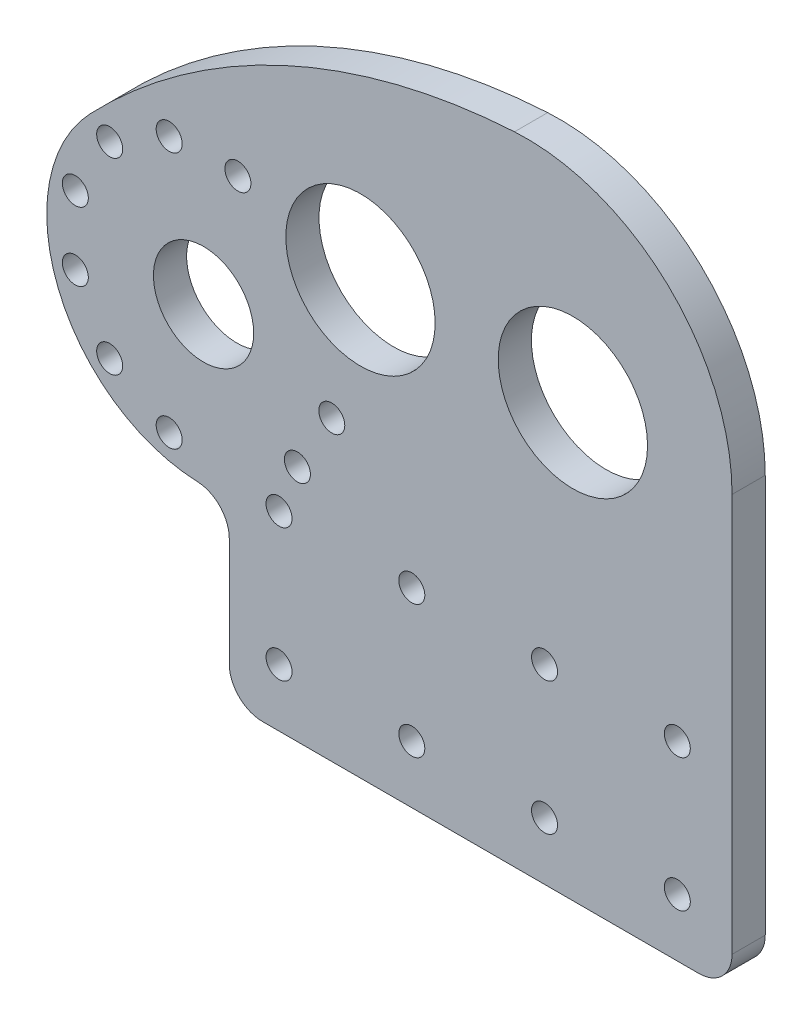
ISO-10303-21;
HEADER;
FILE_DESCRIPTION(('STEP AP214'),'2;1');
FILE_NAME('part.step','',(''),(''),'','','');
FILE_SCHEMA(('AUTOMOTIVE_DESIGN { 1 0 10303 214 1 1 1 1 }'));
ENDSEC;
DATA;
#1=APPLICATION_CONTEXT('core data for automotive mechanical design processes');
#2=APPLICATION_PROTOCOL_DEFINITION('international standard','automotive_design',2000,#1);
#3=PRODUCT_CONTEXT('',#1,'mechanical');
#4=PRODUCT('Part','Part','',(#3));
#5=PRODUCT_RELATED_PRODUCT_CATEGORY('part','',(#4));
#6=PRODUCT_DEFINITION_FORMATION('','',#4);
#7=PRODUCT_DEFINITION_CONTEXT('part definition',#1,'design');
#8=PRODUCT_DEFINITION('design','',#6,#7);
#9=PRODUCT_DEFINITION_SHAPE('','',#8);
#10=(LENGTH_UNIT() NAMED_UNIT(*) SI_UNIT(.MILLI.,.METRE.));
#11=(NAMED_UNIT(*) PLANE_ANGLE_UNIT() SI_UNIT($,.RADIAN.));
#12=(NAMED_UNIT(*) SI_UNIT($,.STERADIAN.) SOLID_ANGLE_UNIT());
#13=UNCERTAINTY_MEASURE_WITH_UNIT(LENGTH_MEASURE(1.E-05),#10,'distance_accuracy_value','');
#14=(GEOMETRIC_REPRESENTATION_CONTEXT(3) GLOBAL_UNCERTAINTY_ASSIGNED_CONTEXT((#13)) GLOBAL_UNIT_ASSIGNED_CONTEXT((#10,
#11,#12)) REPRESENTATION_CONTEXT('',''));
#15=CARTESIAN_POINT('',(0.,0.,0.));
#16=DIRECTION('',(0.,0.,1.));
#17=DIRECTION('',(1.,0.,0.));
#18=AXIS2_PLACEMENT_3D('',#15,#16,#17);
#19=CARTESIAN_POINT('',(533.4,136.8425,3.175));
#20=DIRECTION('',(0.,0.,-1.));
#21=DIRECTION('',(-1.,0.,0.));
#22=AXIS2_PLACEMENT_3D('',#19,#20,#21);
#23=CYLINDRICAL_SURFACE('',#22,2.48919999999989);
#24=CARTESIAN_POINT('',(533.4,136.8425,3.175));
#25=DIRECTION('',(0.,0.,1.));
#26=DIRECTION('',(1.,0.,0.));
#27=AXIS2_PLACEMENT_3D('',#24,#25,#26);
#28=CIRCLE('',#27,2.48919999999989);
#29=CARTESIAN_POINT('',(535.8892,136.8425,3.175));
#30=VERTEX_POINT('',#29);
#31=EDGE_CURVE('E188',#30,#30,#28,.T.);
#32=ORIENTED_EDGE('',*,*,#31,.T.);
#33=EDGE_LOOP('',(#32));
#34=FACE_BOUND('',#33,.T.);
#35=CARTESIAN_POINT('',(533.4,136.8425,-3.175));
#36=DIRECTION('',(0.,0.,1.));
#37=DIRECTION('',(1.,0.,0.));
#38=AXIS2_PLACEMENT_3D('',#35,#36,#37);
#39=CIRCLE('',#38,2.48919999999989);
#40=CARTESIAN_POINT('',(535.8892,136.8425,-3.175));
#41=VERTEX_POINT('',#40);
#42=EDGE_CURVE('E191',#41,#41,#39,.T.);
#43=ORIENTED_EDGE('',*,*,#42,.F.);
#44=EDGE_LOOP('',(#43));
#45=FACE_BOUND('',#44,.T.);
#46=ADVANCED_FACE('F37',(#34,#45),#23,.F.);
#47=CARTESIAN_POINT('',(533.4,111.4425,3.175));
#48=DIRECTION('',(0.,0.,-1.));
#49=DIRECTION('',(-1.,0.,0.));
#50=AXIS2_PLACEMENT_3D('',#47,#48,#49);
#51=CYLINDRICAL_SURFACE('',#50,2.48919999999995);
#52=CARTESIAN_POINT('',(533.4,111.4425,3.175));
#53=DIRECTION('',(0.,0.,1.));
#54=DIRECTION('',(1.,0.,0.));
#55=AXIS2_PLACEMENT_3D('',#52,#53,#54);
#56=CIRCLE('',#55,2.48919999999995);
#57=CARTESIAN_POINT('',(535.8892,111.4425,3.175));
#58=VERTEX_POINT('',#57);
#59=EDGE_CURVE('E182',#58,#58,#56,.T.);
#60=ORIENTED_EDGE('',*,*,#59,.T.);
#61=EDGE_LOOP('',(#60));
#62=FACE_BOUND('',#61,.T.);
#63=CARTESIAN_POINT('',(533.4,111.4425,-3.175));
#64=DIRECTION('',(0.,0.,1.));
#65=DIRECTION('',(1.,0.,0.));
#66=AXIS2_PLACEMENT_3D('',#63,#64,#65);
#67=CIRCLE('',#66,2.48919999999995);
#68=CARTESIAN_POINT('',(535.8892,111.4425,-3.175));
#69=VERTEX_POINT('',#68);
#70=EDGE_CURVE('E185',#69,#69,#67,.T.);
#71=ORIENTED_EDGE('',*,*,#70,.F.);
#72=EDGE_LOOP('',(#71));
#73=FACE_BOUND('',#72,.T.);
#74=ADVANCED_FACE('F345',(#62,#73),#51,.F.);
#75=CARTESIAN_POINT('',(508.,136.8425,3.175));
#76=DIRECTION('',(0.,0.,-1.));
#77=DIRECTION('',(-1.,0.,0.));
#78=AXIS2_PLACEMENT_3D('',#75,#76,#77);
#79=CYLINDRICAL_SURFACE('',#78,2.48919999999989);
#80=CARTESIAN_POINT('',(508.,136.8425,3.175));
#81=DIRECTION('',(0.,0.,1.));
#82=DIRECTION('',(1.,0.,0.));
#83=AXIS2_PLACEMENT_3D('',#80,#81,#82);
#84=CIRCLE('',#83,2.48919999999989);
#85=CARTESIAN_POINT('',(510.4892,136.8425,3.175));
#86=VERTEX_POINT('',#85);
#87=EDGE_CURVE('E176',#86,#86,#84,.T.);
#88=ORIENTED_EDGE('',*,*,#87,.T.);
#89=EDGE_LOOP('',(#88));
#90=FACE_BOUND('',#89,.T.);
#91=CARTESIAN_POINT('',(508.,136.8425,-3.175));
#92=DIRECTION('',(0.,0.,1.));
#93=DIRECTION('',(1.,0.,0.));
#94=AXIS2_PLACEMENT_3D('',#91,#92,#93);
#95=CIRCLE('',#94,2.48919999999989);
#96=CARTESIAN_POINT('',(510.4892,136.8425,-3.175));
#97=VERTEX_POINT('',#96);
#98=EDGE_CURVE('E179',#97,#97,#95,.T.);
#99=ORIENTED_EDGE('',*,*,#98,.F.);
#100=EDGE_LOOP('',(#99));
#101=FACE_BOUND('',#100,.T.);
#102=ADVANCED_FACE('F351',(#90,#101),#79,.F.);
#103=CARTESIAN_POINT('',(508.,111.4425,3.175));
#104=DIRECTION('',(0.,0.,-1.));
#105=DIRECTION('',(-1.,0.,0.));
#106=AXIS2_PLACEMENT_3D('',#103,#104,#105);
#107=CYLINDRICAL_SURFACE('',#106,2.48919999999995);
#108=CARTESIAN_POINT('',(508.,111.4425,3.175));
#109=DIRECTION('',(0.,0.,1.));
#110=DIRECTION('',(1.,0.,0.));
#111=AXIS2_PLACEMENT_3D('',#108,#109,#110);
#112=CIRCLE('',#111,2.48919999999995);
#113=CARTESIAN_POINT('',(510.4892,111.4425,3.175));
#114=VERTEX_POINT('',#113);
#115=EDGE_CURVE('E170',#114,#114,#112,.T.);
#116=ORIENTED_EDGE('',*,*,#115,.T.);
#117=EDGE_LOOP('',(#116));
#118=FACE_BOUND('',#117,.T.);
#119=CARTESIAN_POINT('',(508.,111.4425,-3.175));
#120=DIRECTION('',(0.,0.,1.));
#121=DIRECTION('',(1.,0.,0.));
#122=AXIS2_PLACEMENT_3D('',#119,#120,#121);
#123=CIRCLE('',#122,2.48919999999995);
#124=CARTESIAN_POINT('',(510.4892,111.4425,-3.175));
#125=VERTEX_POINT('',#124);
#126=EDGE_CURVE('E173',#125,#125,#123,.T.);
#127=ORIENTED_EDGE('',*,*,#126,.F.);
#128=EDGE_LOOP('',(#127));
#129=FACE_BOUND('',#128,.T.);
#130=ADVANCED_FACE('F382',(#118,#129),#107,.F.);
#131=CARTESIAN_POINT('',(482.6,136.8425,3.175));
#132=DIRECTION('',(0.,0.,-1.));
#133=DIRECTION('',(-1.,0.,0.));
#134=AXIS2_PLACEMENT_3D('',#131,#132,#133);
#135=CYLINDRICAL_SURFACE('',#134,2.48919999999989);
#136=CARTESIAN_POINT('',(482.6,136.8425,3.175));
#137=DIRECTION('',(0.,0.,1.));
#138=DIRECTION('',(1.,0.,0.));
#139=AXIS2_PLACEMENT_3D('',#136,#137,#138);
#140=CIRCLE('',#139,2.48919999999989);
#141=CARTESIAN_POINT('',(485.0892,136.8425,3.175));
#142=VERTEX_POINT('',#141);
#143=EDGE_CURVE('E164',#142,#142,#140,.T.);
#144=ORIENTED_EDGE('',*,*,#143,.T.);
#145=EDGE_LOOP('',(#144));
#146=FACE_BOUND('',#145,.T.);
#147=CARTESIAN_POINT('',(482.6,136.8425,-3.175));
#148=DIRECTION('',(0.,0.,1.));
#149=DIRECTION('',(1.,0.,0.));
#150=AXIS2_PLACEMENT_3D('',#147,#148,#149);
#151=CIRCLE('',#150,2.48919999999989);
#152=CARTESIAN_POINT('',(485.0892,136.8425,-3.175));
#153=VERTEX_POINT('',#152);
#154=EDGE_CURVE('E167',#153,#153,#151,.T.);
#155=ORIENTED_EDGE('',*,*,#154,.F.);
#156=EDGE_LOOP('',(#155));
#157=FACE_BOUND('',#156,.T.);
#158=ADVANCED_FACE('F338',(#146,#157),#135,.F.);
#159=CARTESIAN_POINT('',(482.6,111.4425,3.175));
#160=DIRECTION('',(0.,0.,-1.));
#161=DIRECTION('',(-1.,0.,0.));
#162=AXIS2_PLACEMENT_3D('',#159,#160,#161);
#163=CYLINDRICAL_SURFACE('',#162,2.48919999999995);
#164=CARTESIAN_POINT('',(482.6,111.4425,3.175));
#165=DIRECTION('',(0.,0.,1.));
#166=DIRECTION('',(1.,0.,0.));
#167=AXIS2_PLACEMENT_3D('',#164,#165,#166);
#168=CIRCLE('',#167,2.48919999999995);
#169=CARTESIAN_POINT('',(485.0892,111.4425,3.175));
#170=VERTEX_POINT('',#169);
#171=EDGE_CURVE('E124',#170,#170,#168,.T.);
#172=ORIENTED_EDGE('',*,*,#171,.T.);
#173=EDGE_LOOP('',(#172));
#174=FACE_BOUND('',#173,.T.);
#175=CARTESIAN_POINT('',(482.6,111.4425,-3.175));
#176=DIRECTION('',(0.,0.,1.));
#177=DIRECTION('',(1.,0.,0.));
#178=AXIS2_PLACEMENT_3D('',#175,#176,#177);
#179=CIRCLE('',#178,2.48919999999995);
#180=CARTESIAN_POINT('',(485.0892,111.4425,-3.175));
#181=VERTEX_POINT('',#180);
#182=EDGE_CURVE('E161',#181,#181,#179,.T.);
#183=ORIENTED_EDGE('',*,*,#182,.F.);
#184=EDGE_LOOP('',(#183));
#185=FACE_BOUND('',#184,.T.);
#186=ADVANCED_FACE('F329',(#174,#185),#163,.F.);
#187=CARTESIAN_POINT('',(504.531091269929,182.9435,3.175));
#188=DIRECTION('',(0.,0.,-1.));
#189=DIRECTION('',(-1.,0.,0.));
#190=AXIS2_PLACEMENT_3D('',#187,#188,#189);
#191=PLANE('',#190);
#192=ORIENTED_EDGE('',*,*,#31,.F.);
#193=EDGE_LOOP('',(#192));
#194=FACE_BOUND('',#193,.T.);
#195=ORIENTED_EDGE('',*,*,#59,.F.);
#196=EDGE_LOOP('',(#195));
#197=FACE_BOUND('',#196,.T.);
#198=ORIENTED_EDGE('',*,*,#87,.F.);
#199=EDGE_LOOP('',(#198));
#200=FACE_BOUND('',#199,.T.);
#201=ORIENTED_EDGE('',*,*,#115,.F.);
#202=EDGE_LOOP('',(#201));
#203=FACE_BOUND('',#202,.T.);
#204=ORIENTED_EDGE('',*,*,#143,.F.);
#205=EDGE_LOOP('',(#204));
#206=FACE_BOUND('',#205,.T.);
#207=ORIENTED_EDGE('',*,*,#171,.F.);
#208=EDGE_LOOP('',(#207));
#209=FACE_BOUND('',#208,.T.);
#210=DIRECTION('',(0.,-1.,0.));
#211=VECTOR('',#210,1.);
#212=CARTESIAN_POINT('',(447.675,100.3935,3.175));
#213=LINE('',#212,#211);
#214=CARTESIAN_POINT('',(447.675,127.571609413663,3.175));
#215=VERTEX_POINT('',#214);
#216=CARTESIAN_POINT('',(447.675,106.7435,3.175));
#217=VERTEX_POINT('',#216);
#218=EDGE_CURVE('E138',#215,#217,#213,.T.);
#219=ORIENTED_EDGE('',*,*,#218,.T.);
#220=CARTESIAN_POINT('',(454.025,106.7435,3.175));
#221=DIRECTION('',(0.,0.,-1.));
#222=DIRECTION('',(-1.,0.,0.));
#223=AXIS2_PLACEMENT_3D('',#220,#221,#222);
#224=CIRCLE('',#223,6.35);
#225=CARTESIAN_POINT('',(454.025,100.3935,3.175));
#226=VERTEX_POINT('',#225);
#227=EDGE_CURVE('E210',#217,#226,#224,.F.);
#228=ORIENTED_EDGE('',*,*,#227,.T.);
#229=DIRECTION('',(1.,0.,0.));
#230=VECTOR('',#229,1.);
#231=CARTESIAN_POINT('',(447.675,100.3935,3.175));
#232=LINE('',#231,#230);
#233=CARTESIAN_POINT('',(537.5275,100.3935,3.175));
#234=VERTEX_POINT('',#233);
#235=EDGE_CURVE('E115',#226,#234,#232,.T.);
#236=ORIENTED_EDGE('',*,*,#235,.T.);
#237=CARTESIAN_POINT('',(537.5275,106.7435,3.175));
#238=DIRECTION('',(0.,0.,-1.));
#239=DIRECTION('',(-1.,0.,0.));
#240=AXIS2_PLACEMENT_3D('',#237,#238,#239);
#241=CIRCLE('',#240,6.35);
#242=CARTESIAN_POINT('',(543.8775,106.7435,3.175));
#243=VERTEX_POINT('',#242);
#244=EDGE_CURVE('E52',#234,#243,#241,.F.);
#245=ORIENTED_EDGE('',*,*,#244,.T.);
#246=DIRECTION('',(0.,1.,0.));
#247=VECTOR('',#246,1.);
#248=CARTESIAN_POINT('',(543.8775,100.3935,3.175));
#249=LINE('',#248,#247);
#250=CARTESIAN_POINT('',(543.8775,182.9435,3.175));
#251=VERTEX_POINT('',#250);
#252=EDGE_CURVE('E106',#243,#251,#249,.T.);
#253=ORIENTED_EDGE('',*,*,#252,.T.);
#254=CARTESIAN_POINT('',(504.531091269929,182.9435,3.175));
#255=DIRECTION('',(0.,0.,1.));
#256=DIRECTION('',(-1.,0.,0.));
#257=AXIS2_PLACEMENT_3D('',#254,#255,#256);
#258=CIRCLE('',#257,39.3464087300712);
#259=CARTESIAN_POINT('',(502.250352488172,222.223750897407,3.175));
#260=VERTEX_POINT('',#259);
#261=EDGE_CURVE('E112',#251,#260,#258,.T.);
#262=ORIENTED_EDGE('',*,*,#261,.T.);
#263=CARTESIAN_POINT('',(509.316361248878,100.528711034053,3.175));
#264=DIRECTION('',(0.,0.,1.));
#265=DIRECTION('',(-1.,0.,0.));
#266=AXIS2_PLACEMENT_3D('',#263,#264,#265);
#267=CIRCLE('',#266,121.900004951393);
#268=CARTESIAN_POINT('',(421.02559897986,184.578413621899,3.175));
#269=VERTEX_POINT('',#268);
#270=EDGE_CURVE('E130',#260,#269,#267,.T.);
#271=ORIENTED_EDGE('',*,*,#270,.T.);
#272=CARTESIAN_POINT('',(442.754251609386,163.8935,3.175));
#273=DIRECTION('',(0.,0.,1.));
#274=DIRECTION('',(-1.,0.,0.));
#275=AXIS2_PLACEMENT_3D('',#272,#273,#274);
#276=CIRCLE('',#275,29.999999944);
#277=CARTESIAN_POINT('',(441.574676691433,133.916698975659,3.175));
#278=VERTEX_POINT('',#277);
#279=EDGE_CURVE('E132',#269,#278,#276,.T.);
#280=ORIENTED_EDGE('',*,*,#279,.T.);
#281=CARTESIAN_POINT('',(441.325,127.571609413663,3.175));
#282=DIRECTION('',(0.,0.,-1.));
#283=DIRECTION('',(-1.,0.,0.));
#284=AXIS2_PLACEMENT_3D('',#281,#282,#283);
#285=CIRCLE('',#284,6.35);
#286=EDGE_CURVE('E11',#278,#215,#285,.T.);
#287=ORIENTED_EDGE('',*,*,#286,.T.);
#288=EDGE_LOOP('',(#219,#228,#236,#245,#253,#262,#271,#280,#287));
#289=FACE_BOUND('',#288,.T.);
#290=CARTESIAN_POINT('',(513.421091269929,182.9435,3.175));
#291=DIRECTION('',(0.,0.,1.));
#292=DIRECTION('',(1.,0.,0.));
#293=AXIS2_PLACEMENT_3D('',#290,#291,#292);
#294=CIRCLE('',#293,14.2875);
#295=CARTESIAN_POINT('',(527.708591269929,182.9435,3.175));
#296=VERTEX_POINT('',#295);
#297=EDGE_CURVE('E144',#296,#296,#294,.T.);
#298=ORIENTED_EDGE('',*,*,#297,.F.);
#299=EDGE_LOOP('',(#298));
#300=FACE_BOUND('',#299,.T.);
#301=CARTESIAN_POINT('',(449.32825535499,188.428015987742,3.175));
#302=DIRECTION('',(0.,0.,1.));
#303=DIRECTION('',(1.,0.,0.));
#304=AXIS2_PLACEMENT_3D('',#301,#302,#303);
#305=CIRCLE('',#304,2.48920000000001);
#306=CARTESIAN_POINT('',(451.81745535499,188.428015987742,3.175));
#307=VERTEX_POINT('',#306);
#308=EDGE_CURVE('E244',#307,#307,#305,.T.);
#309=ORIENTED_EDGE('',*,*,#308,.F.);
#310=EDGE_LOOP('',(#309));
#311=FACE_BOUND('',#310,.T.);
#312=CARTESIAN_POINT('',(467.288767597128,157.319496254396,3.175));
#313=DIRECTION('',(0.,0.,1.));
#314=DIRECTION('',(1.,0.,0.));
#315=AXIS2_PLACEMENT_3D('',#312,#313,#314);
#316=CIRCLE('',#315,2.48920000000001);
#317=CARTESIAN_POINT('',(469.777967597128,157.319496254396,3.175));
#318=VERTEX_POINT('',#317);
#319=EDGE_CURVE('E250',#318,#318,#316,.T.);
#320=ORIENTED_EDGE('',*,*,#319,.F.);
#321=EDGE_LOOP('',(#320));
#322=FACE_BOUND('',#321,.T.);
#323=CARTESIAN_POINT('',(460.714763851524,145.932987757862,3.175));
#324=DIRECTION('',(0.,0.,1.));
#325=DIRECTION('',(1.,0.,0.));
#326=AXIS2_PLACEMENT_3D('',#323,#324,#325);
#327=CIRCLE('',#326,2.48919999999995);
#328=CARTESIAN_POINT('',(463.203963851524,145.932987757862,3.175));
#329=VERTEX_POINT('',#328);
#330=EDGE_CURVE('E256',#329,#329,#327,.T.);
#331=ORIENTED_EDGE('',*,*,#330,.F.);
#332=EDGE_LOOP('',(#331));
#333=FACE_BOUND('',#332,.T.);
#334=CARTESIAN_POINT('',(436.180247863782,139.358984012258,3.175));
#335=DIRECTION('',(0.,0.,1.));
#336=DIRECTION('',(1.,0.,0.));
#337=AXIS2_PLACEMENT_3D('',#334,#335,#336);
#338=CIRCLE('',#337,2.48920000000001);
#339=CARTESIAN_POINT('',(438.669447863782,139.358984012258,3.175));
#340=VERTEX_POINT('',#339);
#341=EDGE_CURVE('E262',#340,#340,#338,.T.);
#342=ORIENTED_EDGE('',*,*,#341,.F.);
#343=EDGE_LOOP('',(#342));
#344=FACE_BOUND('',#343,.T.);
#345=CARTESIAN_POINT('',(424.793739367247,145.932987757862,3.175));
#346=DIRECTION('',(0.,0.,1.));
#347=DIRECTION('',(1.,0.,0.));
#348=AXIS2_PLACEMENT_3D('',#345,#346,#347);
#349=CIRCLE('',#348,2.48919999999995);
#350=CARTESIAN_POINT('',(427.282939367247,145.932987757862,3.175));
#351=VERTEX_POINT('',#350);
#352=EDGE_CURVE('E268',#351,#351,#349,.T.);
#353=ORIENTED_EDGE('',*,*,#352,.F.);
#354=EDGE_LOOP('',(#353));
#355=FACE_BOUND('',#354,.T.);
#356=CARTESIAN_POINT('',(472.781091269929,182.9435,3.175));
#357=DIRECTION('',(0.,0.,1.));
#358=DIRECTION('',(1.,0.,0.));
#359=AXIS2_PLACEMENT_3D('',#356,#357,#358);
#360=CIRCLE('',#359,14.2875);
#361=CARTESIAN_POINT('',(487.068591269929,182.9435,3.175));
#362=VERTEX_POINT('',#361);
#363=EDGE_CURVE('E274',#362,#362,#360,.T.);
#364=ORIENTED_EDGE('',*,*,#363,.F.);
#365=EDGE_LOOP('',(#364));
#366=FACE_BOUND('',#365,.T.);
#367=CARTESIAN_POINT('',(418.219735621643,157.319496254396,3.175));
#368=DIRECTION('',(0.,0.,1.));
#369=DIRECTION('',(1.,0.,0.));
#370=AXIS2_PLACEMENT_3D('',#367,#368,#369);
#371=CIRCLE('',#370,2.48920000000001);
#372=CARTESIAN_POINT('',(420.708935621643,157.319496254396,3.175));
#373=VERTEX_POINT('',#372);
#374=EDGE_CURVE('E280',#373,#373,#371,.T.);
#375=ORIENTED_EDGE('',*,*,#374,.F.);
#376=EDGE_LOOP('',(#375));
#377=FACE_BOUND('',#376,.T.);
#378=CARTESIAN_POINT('',(418.219735621643,170.467503745604,3.175));
#379=DIRECTION('',(0.,0.,1.));
#380=DIRECTION('',(1.,0.,0.));
#381=AXIS2_PLACEMENT_3D('',#378,#379,#380);
#382=CIRCLE('',#381,2.48920000000001);
#383=CARTESIAN_POINT('',(420.708935621643,170.467503745604,3.175));
#384=VERTEX_POINT('',#383);
#385=EDGE_CURVE('E286',#384,#384,#382,.T.);
#386=ORIENTED_EDGE('',*,*,#385,.F.);
#387=EDGE_LOOP('',(#386));
#388=FACE_BOUND('',#387,.T.);
#389=CARTESIAN_POINT('',(424.793739367247,181.854012242138,3.175));
#390=DIRECTION('',(0.,0.,1.));
#391=DIRECTION('',(1.,0.,0.));
#392=AXIS2_PLACEMENT_3D('',#389,#390,#391);
#393=CIRCLE('',#392,2.48919999999995);
#394=CARTESIAN_POINT('',(427.282939367247,181.854012242138,3.175));
#395=VERTEX_POINT('',#394);
#396=EDGE_CURVE('E292',#395,#395,#393,.T.);
#397=ORIENTED_EDGE('',*,*,#396,.F.);
#398=EDGE_LOOP('',(#397));
#399=FACE_BOUND('',#398,.T.);
#400=CARTESIAN_POINT('',(436.180247863782,188.428015987742,3.175));
#401=DIRECTION('',(0.,0.,1.));
#402=DIRECTION('',(1.,0.,0.));
#403=AXIS2_PLACEMENT_3D('',#400,#401,#402);
#404=CIRCLE('',#403,2.48920000000001);
#405=CARTESIAN_POINT('',(438.669447863782,188.428015987742,3.175));
#406=VERTEX_POINT('',#405);
#407=EDGE_CURVE('E298',#406,#406,#404,.T.);
#408=ORIENTED_EDGE('',*,*,#407,.F.);
#409=EDGE_LOOP('',(#408));
#410=FACE_BOUND('',#409,.T.);
#411=CARTESIAN_POINT('',(457.2,111.4425,3.175));
#412=DIRECTION('',(0.,0.,1.));
#413=DIRECTION('',(1.,0.,0.));
#414=AXIS2_PLACEMENT_3D('',#411,#412,#413);
#415=CIRCLE('',#414,2.48919999999995);
#416=CARTESIAN_POINT('',(459.6892,111.4425,3.175));
#417=VERTEX_POINT('',#416);
#418=EDGE_CURVE('E304',#417,#417,#415,.T.);
#419=ORIENTED_EDGE('',*,*,#418,.F.);
#420=EDGE_LOOP('',(#419));
#421=FACE_BOUND('',#420,.T.);
#422=CARTESIAN_POINT('',(457.2,136.8425,3.175));
#423=DIRECTION('',(0.,0.,1.));
#424=DIRECTION('',(1.,0.,0.));
#425=AXIS2_PLACEMENT_3D('',#422,#423,#424);
#426=CIRCLE('',#425,2.48919999999989);
#427=CARTESIAN_POINT('',(459.6892,136.8425,3.175));
#428=VERTEX_POINT('',#427);
#429=EDGE_CURVE('E310',#428,#428,#426,.T.);
#430=ORIENTED_EDGE('',*,*,#429,.F.);
#431=EDGE_LOOP('',(#430));
#432=FACE_BOUND('',#431,.T.);
#433=CARTESIAN_POINT('',(442.754251609386,163.8935,3.175));
#434=DIRECTION('',(0.,0.,1.));
#435=DIRECTION('',(1.,0.,0.));
#436=AXIS2_PLACEMENT_3D('',#433,#434,#435);
#437=CIRCLE('',#436,9.5885);
#438=CARTESIAN_POINT('',(452.342751609386,163.8935,3.175));
#439=VERTEX_POINT('',#438);
#440=EDGE_CURVE('E316',#439,#439,#437,.T.);
#441=ORIENTED_EDGE('',*,*,#440,.F.);
#442=EDGE_LOOP('',(#441));
#443=FACE_BOUND('',#442,.T.);
#444=ADVANCED_FACE('F109',(#194,#197,#200,#203,#206,#209,#289,#300,#311,#322,#333,#344,#355,
#366,#377,#388,#399,#410,#421,#432,#443),#191,.F.);
#445=CARTESIAN_POINT('',(504.531091269929,182.9435,-3.175));
#446=DIRECTION('',(0.,0.,-1.));
#447=DIRECTION('',(-1.,0.,0.));
#448=AXIS2_PLACEMENT_3D('',#445,#446,#447);
#449=PLANE('',#448);
#450=ORIENTED_EDGE('',*,*,#70,.T.);
#451=EDGE_LOOP('',(#450));
#452=FACE_BOUND('',#451,.T.);
#453=ORIENTED_EDGE('',*,*,#42,.T.);
#454=EDGE_LOOP('',(#453));
#455=FACE_BOUND('',#454,.T.);
#456=ORIENTED_EDGE('',*,*,#126,.T.);
#457=EDGE_LOOP('',(#456));
#458=FACE_BOUND('',#457,.T.);
#459=ORIENTED_EDGE('',*,*,#98,.T.);
#460=EDGE_LOOP('',(#459));
#461=FACE_BOUND('',#460,.T.);
#462=ORIENTED_EDGE('',*,*,#182,.T.);
#463=EDGE_LOOP('',(#462));
#464=FACE_BOUND('',#463,.T.);
#465=ORIENTED_EDGE('',*,*,#154,.T.);
#466=EDGE_LOOP('',(#465));
#467=FACE_BOUND('',#466,.T.);
#468=CARTESIAN_POINT('',(457.2,136.8425,-3.175));
#469=DIRECTION('',(0.,0.,1.));
#470=DIRECTION('',(1.,0.,0.));
#471=AXIS2_PLACEMENT_3D('',#468,#469,#470);
#472=CIRCLE('',#471,2.48919999999989);
#473=CARTESIAN_POINT('',(459.6892,136.8425,-3.175));
#474=VERTEX_POINT('',#473);
#475=EDGE_CURVE('E313',#474,#474,#472,.T.);
#476=ORIENTED_EDGE('',*,*,#475,.T.);
#477=EDGE_LOOP('',(#476));
#478=FACE_BOUND('',#477,.T.);
#479=CARTESIAN_POINT('',(436.180247863782,188.428015987742,-3.175));
#480=DIRECTION('',(0.,0.,1.));
#481=DIRECTION('',(1.,0.,0.));
#482=AXIS2_PLACEMENT_3D('',#479,#480,#481);
#483=CIRCLE('',#482,2.48920000000001);
#484=CARTESIAN_POINT('',(438.669447863782,188.428015987742,-3.175));
#485=VERTEX_POINT('',#484);
#486=EDGE_CURVE('E301',#485,#485,#483,.T.);
#487=ORIENTED_EDGE('',*,*,#486,.T.);
#488=EDGE_LOOP('',(#487));
#489=FACE_BOUND('',#488,.T.);
#490=CARTESIAN_POINT('',(418.219735621643,170.467503745604,-3.175));
#491=DIRECTION('',(0.,0.,1.));
#492=DIRECTION('',(1.,0.,0.));
#493=AXIS2_PLACEMENT_3D('',#490,#491,#492);
#494=CIRCLE('',#493,2.48920000000001);
#495=CARTESIAN_POINT('',(420.708935621643,170.467503745604,-3.175));
#496=VERTEX_POINT('',#495);
#497=EDGE_CURVE('E289',#496,#496,#494,.T.);
#498=ORIENTED_EDGE('',*,*,#497,.T.);
#499=EDGE_LOOP('',(#498));
#500=FACE_BOUND('',#499,.T.);
#501=CARTESIAN_POINT('',(472.781091269929,182.9435,-3.175));
#502=DIRECTION('',(0.,0.,1.));
#503=DIRECTION('',(1.,0.,0.));
#504=AXIS2_PLACEMENT_3D('',#501,#502,#503);
#505=CIRCLE('',#504,14.2875);
#506=CARTESIAN_POINT('',(487.068591269929,182.9435,-3.175));
#507=VERTEX_POINT('',#506);
#508=EDGE_CURVE('E277',#507,#507,#505,.T.);
#509=ORIENTED_EDGE('',*,*,#508,.T.);
#510=EDGE_LOOP('',(#509));
#511=FACE_BOUND('',#510,.T.);
#512=CARTESIAN_POINT('',(436.180247863782,139.358984012258,-3.175));
#513=DIRECTION('',(0.,0.,1.));
#514=DIRECTION('',(1.,0.,0.));
#515=AXIS2_PLACEMENT_3D('',#512,#513,#514);
#516=CIRCLE('',#515,2.48920000000001);
#517=CARTESIAN_POINT('',(438.669447863782,139.358984012258,-3.175));
#518=VERTEX_POINT('',#517);
#519=EDGE_CURVE('E265',#518,#518,#516,.T.);
#520=ORIENTED_EDGE('',*,*,#519,.T.);
#521=EDGE_LOOP('',(#520));
#522=FACE_BOUND('',#521,.T.);
#523=CARTESIAN_POINT('',(467.288767597128,157.319496254396,-3.175));
#524=DIRECTION('',(0.,0.,1.));
#525=DIRECTION('',(1.,0.,0.));
#526=AXIS2_PLACEMENT_3D('',#523,#524,#525);
#527=CIRCLE('',#526,2.48920000000001);
#528=CARTESIAN_POINT('',(469.777967597128,157.319496254396,-3.175));
#529=VERTEX_POINT('',#528);
#530=EDGE_CURVE('E253',#529,#529,#527,.T.);
#531=ORIENTED_EDGE('',*,*,#530,.T.);
#532=EDGE_LOOP('',(#531));
#533=FACE_BOUND('',#532,.T.);
#534=CARTESIAN_POINT('',(513.421091269929,182.9435,-3.175));
#535=DIRECTION('',(0.,0.,1.));
#536=DIRECTION('',(1.,0.,0.));
#537=AXIS2_PLACEMENT_3D('',#534,#535,#536);
#538=CIRCLE('',#537,14.2875);
#539=CARTESIAN_POINT('',(527.708591269929,182.9435,-3.175));
#540=VERTEX_POINT('',#539);
#541=EDGE_CURVE('E241',#540,#540,#538,.T.);
#542=ORIENTED_EDGE('',*,*,#541,.T.);
#543=EDGE_LOOP('',(#542));
#544=FACE_BOUND('',#543,.T.);
#545=DIRECTION('',(1.,0.,0.));
#546=VECTOR('',#545,1.);
#547=CARTESIAN_POINT('',(447.675,100.3935,-3.175));
#548=LINE('',#547,#546);
#549=CARTESIAN_POINT('',(454.025,100.3935,-3.175));
#550=VERTEX_POINT('',#549);
#551=CARTESIAN_POINT('',(537.5275,100.3935,-3.175));
#552=VERTEX_POINT('',#551);
#553=EDGE_CURVE('E141',#550,#552,#548,.T.);
#554=ORIENTED_EDGE('',*,*,#553,.F.);
#555=CARTESIAN_POINT('',(454.025,106.7435,-3.175));
#556=DIRECTION('',(0.,0.,-1.));
#557=DIRECTION('',(-1.,0.,0.));
#558=AXIS2_PLACEMENT_3D('',#555,#556,#557);
#559=CIRCLE('',#558,6.35);
#560=CARTESIAN_POINT('',(447.675,106.7435,-3.175));
#561=VERTEX_POINT('',#560);
#562=EDGE_CURVE('E207',#550,#561,#559,.T.);
#563=ORIENTED_EDGE('',*,*,#562,.T.);
#564=DIRECTION('',(0.,-1.,0.));
#565=VECTOR('',#564,1.);
#566=CARTESIAN_POINT('',(447.675,100.3935,-3.175));
#567=LINE('',#566,#565);
#568=CARTESIAN_POINT('',(447.675,127.571609413663,-3.175));
#569=VERTEX_POINT('',#568);
#570=EDGE_CURVE('E153',#569,#561,#567,.T.);
#571=ORIENTED_EDGE('',*,*,#570,.F.);
#572=CARTESIAN_POINT('',(441.325,127.571609413663,-3.175));
#573=DIRECTION('',(0.,0.,-1.));
#574=DIRECTION('',(-1.,0.,0.));
#575=AXIS2_PLACEMENT_3D('',#572,#573,#574);
#576=CIRCLE('',#575,6.35);
#577=CARTESIAN_POINT('',(441.574676691433,133.916698975659,-3.175));
#578=VERTEX_POINT('',#577);
#579=EDGE_CURVE('E45',#569,#578,#576,.F.);
#580=ORIENTED_EDGE('',*,*,#579,.T.);
#581=CARTESIAN_POINT('',(442.754251609386,163.8935,-3.175));
#582=DIRECTION('',(0.,0.,1.));
#583=DIRECTION('',(-1.,0.,0.));
#584=AXIS2_PLACEMENT_3D('',#581,#582,#583);
#585=CIRCLE('',#584,29.999999944);
#586=CARTESIAN_POINT('',(421.02559897986,184.578413621899,-3.175));
#587=VERTEX_POINT('',#586);
#588=EDGE_CURVE('E150',#587,#578,#585,.T.);
#589=ORIENTED_EDGE('',*,*,#588,.F.);
#590=CARTESIAN_POINT('',(509.316361248878,100.528711034053,-3.175));
#591=DIRECTION('',(0.,0.,1.));
#592=DIRECTION('',(-1.,0.,0.));
#593=AXIS2_PLACEMENT_3D('',#590,#591,#592);
#594=CIRCLE('',#593,121.900004951393);
#595=CARTESIAN_POINT('',(502.250352488172,222.223750897407,-3.175));
#596=VERTEX_POINT('',#595);
#597=EDGE_CURVE('E148',#596,#587,#594,.T.);
#598=ORIENTED_EDGE('',*,*,#597,.F.);
#599=CARTESIAN_POINT('',(504.531091269929,182.9435,-3.175));
#600=DIRECTION('',(0.,0.,1.));
#601=DIRECTION('',(-1.,0.,0.));
#602=AXIS2_PLACEMENT_3D('',#599,#600,#601);
#603=CIRCLE('',#602,39.3464087300712);
#604=CARTESIAN_POINT('',(543.8775,182.9435,-3.175));
#605=VERTEX_POINT('',#604);
#606=EDGE_CURVE('E146',#605,#596,#603,.T.);
#607=ORIENTED_EDGE('',*,*,#606,.F.);
#608=DIRECTION('',(0.,1.,0.));
#609=VECTOR('',#608,1.);
#610=CARTESIAN_POINT('',(543.8775,100.3935,-3.175));
#611=LINE('',#610,#609);
#612=CARTESIAN_POINT('',(543.8775,106.7435,-3.175));
#613=VERTEX_POINT('',#612);
#614=EDGE_CURVE('E121',#613,#605,#611,.T.);
#615=ORIENTED_EDGE('',*,*,#614,.F.);
#616=CARTESIAN_POINT('',(537.5275,106.7435,-3.175));
#617=DIRECTION('',(0.,0.,-1.));
#618=DIRECTION('',(-1.,0.,0.));
#619=AXIS2_PLACEMENT_3D('',#616,#617,#618);
#620=CIRCLE('',#619,6.35);
#621=EDGE_CURVE('E60',#613,#552,#620,.T.);
#622=ORIENTED_EDGE('',*,*,#621,.T.);
#623=EDGE_LOOP('',(#554,#563,#571,#580,#589,#598,#607,#615,#622));
#624=FACE_BOUND('',#623,.T.);
#625=CARTESIAN_POINT('',(449.32825535499,188.428015987742,-3.175));
#626=DIRECTION('',(0.,0.,1.));
#627=DIRECTION('',(1.,0.,0.));
#628=AXIS2_PLACEMENT_3D('',#625,#626,#627);
#629=CIRCLE('',#628,2.48920000000001);
#630=CARTESIAN_POINT('',(451.81745535499,188.428015987742,-3.175));
#631=VERTEX_POINT('',#630);
#632=EDGE_CURVE('E247',#631,#631,#629,.T.);
#633=ORIENTED_EDGE('',*,*,#632,.T.);
#634=EDGE_LOOP('',(#633));
#635=FACE_BOUND('',#634,.T.);
#636=CARTESIAN_POINT('',(460.714763851524,145.932987757862,-3.175));
#637=DIRECTION('',(0.,0.,1.));
#638=DIRECTION('',(1.,0.,0.));
#639=AXIS2_PLACEMENT_3D('',#636,#637,#638);
#640=CIRCLE('',#639,2.48919999999995);
#641=CARTESIAN_POINT('',(463.203963851524,145.932987757862,-3.175));
#642=VERTEX_POINT('',#641);
#643=EDGE_CURVE('E259',#642,#642,#640,.T.);
#644=ORIENTED_EDGE('',*,*,#643,.T.);
#645=EDGE_LOOP('',(#644));
#646=FACE_BOUND('',#645,.T.);
#647=CARTESIAN_POINT('',(424.793739367247,145.932987757862,-3.175));
#648=DIRECTION('',(0.,0.,1.));
#649=DIRECTION('',(1.,0.,0.));
#650=AXIS2_PLACEMENT_3D('',#647,#648,#649);
#651=CIRCLE('',#650,2.48919999999995);
#652=CARTESIAN_POINT('',(427.282939367247,145.932987757862,-3.175));
#653=VERTEX_POINT('',#652);
#654=EDGE_CURVE('E271',#653,#653,#651,.T.);
#655=ORIENTED_EDGE('',*,*,#654,.T.);
#656=EDGE_LOOP('',(#655));
#657=FACE_BOUND('',#656,.T.);
#658=CARTESIAN_POINT('',(418.219735621643,157.319496254396,-3.175));
#659=DIRECTION('',(0.,0.,1.));
#660=DIRECTION('',(1.,0.,0.));
#661=AXIS2_PLACEMENT_3D('',#658,#659,#660);
#662=CIRCLE('',#661,2.48920000000001);
#663=CARTESIAN_POINT('',(420.708935621643,157.319496254396,-3.175));
#664=VERTEX_POINT('',#663);
#665=EDGE_CURVE('E283',#664,#664,#662,.T.);
#666=ORIENTED_EDGE('',*,*,#665,.T.);
#667=EDGE_LOOP('',(#666));
#668=FACE_BOUND('',#667,.T.);
#669=CARTESIAN_POINT('',(424.793739367247,181.854012242138,-3.175));
#670=DIRECTION('',(0.,0.,1.));
#671=DIRECTION('',(1.,0.,0.));
#672=AXIS2_PLACEMENT_3D('',#669,#670,#671);
#673=CIRCLE('',#672,2.48919999999995);
#674=CARTESIAN_POINT('',(427.282939367247,181.854012242138,-3.175));
#675=VERTEX_POINT('',#674);
#676=EDGE_CURVE('E295',#675,#675,#673,.T.);
#677=ORIENTED_EDGE('',*,*,#676,.T.);
#678=EDGE_LOOP('',(#677));
#679=FACE_BOUND('',#678,.T.);
#680=CARTESIAN_POINT('',(457.2,111.4425,-3.175));
#681=DIRECTION('',(0.,0.,1.));
#682=DIRECTION('',(1.,0.,0.));
#683=AXIS2_PLACEMENT_3D('',#680,#681,#682);
#684=CIRCLE('',#683,2.48919999999995);
#685=CARTESIAN_POINT('',(459.6892,111.4425,-3.175));
#686=VERTEX_POINT('',#685);
#687=EDGE_CURVE('E307',#686,#686,#684,.T.);
#688=ORIENTED_EDGE('',*,*,#687,.T.);
#689=EDGE_LOOP('',(#688));
#690=FACE_BOUND('',#689,.T.);
#691=CARTESIAN_POINT('',(442.754251609386,163.8935,-3.175));
#692=DIRECTION('',(0.,0.,1.));
#693=DIRECTION('',(1.,0.,0.));
#694=AXIS2_PLACEMENT_3D('',#691,#692,#693);
#695=CIRCLE('',#694,9.5885);
#696=CARTESIAN_POINT('',(452.342751609386,163.8935,-3.175));
#697=VERTEX_POINT('',#696);
#698=EDGE_CURVE('E319',#697,#697,#695,.T.);
#699=ORIENTED_EDGE('',*,*,#698,.T.);
#700=EDGE_LOOP('',(#699));
#701=FACE_BOUND('',#700,.T.);
#702=ADVANCED_FACE('F217',(#452,#455,#458,#461,#464,#467,#478,#489,#500,#511,#522,#533,#544,
#624,#635,#646,#657,#668,#679,#690,#701),#449,.T.);
#703=CARTESIAN_POINT('',(447.675,100.3935,3.175));
#704=DIRECTION('',(0.,1.,0.));
#705=DIRECTION('',(0.,0.,1.));
#706=AXIS2_PLACEMENT_3D('',#703,#704,#705);
#707=PLANE('',#706);
#708=ORIENTED_EDGE('',*,*,#235,.F.);
#709=DIRECTION('',(0.,0.,-1.));
#710=VECTOR('',#709,1.);
#711=CARTESIAN_POINT('',(454.025,100.3935,3.175));
#712=LINE('',#711,#710);
#713=EDGE_CURVE('E203',#226,#550,#712,.T.);
#714=ORIENTED_EDGE('',*,*,#713,.T.);
#715=ORIENTED_EDGE('',*,*,#553,.T.);
#716=DIRECTION('',(0.,0.,-1.));
#717=VECTOR('',#716,1.);
#718=CARTESIAN_POINT('',(537.5275,100.3935,3.175));
#719=LINE('',#718,#717);
#720=EDGE_CURVE('E201',#552,#234,#719,.F.);
#721=ORIENTED_EDGE('',*,*,#720,.T.);
#722=EDGE_LOOP('',(#708,#714,#715,#721));
#723=FACE_BOUND('',#722,.T.);
#724=ADVANCED_FACE('F239',(#723),#707,.F.);
#725=CARTESIAN_POINT('',(543.8775,100.3935,3.175));
#726=DIRECTION('',(-1.,0.,0.));
#727=DIRECTION('',(0.,-1.,0.));
#728=AXIS2_PLACEMENT_3D('',#725,#726,#727);
#729=PLANE('',#728);
#730=ORIENTED_EDGE('',*,*,#252,.F.);
#731=DIRECTION('',(0.,0.,-1.));
#732=VECTOR('',#731,1.);
#733=CARTESIAN_POINT('',(543.8775,106.7435,3.175));
#734=LINE('',#733,#732);
#735=EDGE_CURVE('E212',#243,#613,#734,.T.);
#736=ORIENTED_EDGE('',*,*,#735,.T.);
#737=ORIENTED_EDGE('',*,*,#614,.T.);
#738=DIRECTION('',(0.,0.,-1.));
#739=VECTOR('',#738,1.);
#740=CARTESIAN_POINT('',(543.8775,182.9435,3.175));
#741=LINE('',#740,#739);
#742=EDGE_CURVE('E118',#251,#605,#741,.T.);
#743=ORIENTED_EDGE('',*,*,#742,.F.);
#744=EDGE_LOOP('',(#730,#736,#737,#743));
#745=FACE_BOUND('',#744,.T.);
#746=ADVANCED_FACE('F119',(#745),#729,.F.);
#747=CARTESIAN_POINT('',(504.531091269929,182.9435,3.175));
#748=DIRECTION('',(0.,0.,-1.));
#749=DIRECTION('',(-1.,0.,0.));
#750=AXIS2_PLACEMENT_3D('',#747,#748,#749);
#751=CYLINDRICAL_SURFACE('',#750,39.3464087300712);
#752=ORIENTED_EDGE('',*,*,#606,.T.);
#753=DIRECTION('',(0.,0.,-1.));
#754=VECTOR('',#753,1.);
#755=CARTESIAN_POINT('',(502.250352488172,222.223750897407,3.175));
#756=LINE('',#755,#754);
#757=EDGE_CURVE('E125',#260,#596,#756,.T.);
#758=ORIENTED_EDGE('',*,*,#757,.F.);
#759=ORIENTED_EDGE('',*,*,#261,.F.);
#760=ORIENTED_EDGE('',*,*,#742,.T.);
#761=EDGE_LOOP('',(#752,#758,#759,#760));
#762=FACE_BOUND('',#761,.T.);
#763=ADVANCED_FACE('F127',(#762),#751,.T.);
#764=CARTESIAN_POINT('',(509.316361248878,100.528711034053,3.175));
#765=DIRECTION('',(0.,0.,-1.));
#766=DIRECTION('',(-1.,0.,0.));
#767=AXIS2_PLACEMENT_3D('',#764,#765,#766);
#768=CYLINDRICAL_SURFACE('',#767,121.900004951393);
#769=ORIENTED_EDGE('',*,*,#597,.T.);
#770=DIRECTION('',(0.,0.,-1.));
#771=VECTOR('',#770,1.);
#772=CARTESIAN_POINT('',(421.02559897986,184.578413621899,3.175));
#773=LINE('',#772,#771);
#774=EDGE_CURVE('E140',#269,#587,#773,.T.);
#775=ORIENTED_EDGE('',*,*,#774,.F.);
#776=ORIENTED_EDGE('',*,*,#270,.F.);
#777=ORIENTED_EDGE('',*,*,#757,.T.);
#778=EDGE_LOOP('',(#769,#775,#776,#777));
#779=FACE_BOUND('',#778,.T.);
#780=ADVANCED_FACE('F365',(#779),#768,.T.);
#781=CARTESIAN_POINT('',(442.754251609386,163.8935,3.175));
#782=DIRECTION('',(0.,0.,-1.));
#783=DIRECTION('',(-1.,0.,0.));
#784=AXIS2_PLACEMENT_3D('',#781,#782,#783);
#785=CYLINDRICAL_SURFACE('',#784,29.999999944);
#786=ORIENTED_EDGE('',*,*,#588,.T.);
#787=DIRECTION('',(0.,0.,-1.));
#788=VECTOR('',#787,1.);
#789=CARTESIAN_POINT('',(441.574676691433,133.916698975659,3.175));
#790=LINE('',#789,#788);
#791=EDGE_CURVE('E199',#578,#278,#790,.F.);
#792=ORIENTED_EDGE('',*,*,#791,.T.);
#793=ORIENTED_EDGE('',*,*,#279,.F.);
#794=ORIENTED_EDGE('',*,*,#774,.T.);
#795=EDGE_LOOP('',(#786,#792,#793,#794));
#796=FACE_BOUND('',#795,.T.);
#797=ADVANCED_FACE('F224',(#796),#785,.T.);
#798=CARTESIAN_POINT('',(447.675,100.3935,3.175));
#799=DIRECTION('',(1.,0.,0.));
#800=DIRECTION('',(0.,0.,-1.));
#801=AXIS2_PLACEMENT_3D('',#798,#799,#800);
#802=PLANE('',#801);
#803=ORIENTED_EDGE('',*,*,#218,.F.);
#804=DIRECTION('',(0.,0.,1.));
#805=VECTOR('',#804,1.);
#806=CARTESIAN_POINT('',(447.675,127.571609413663,-3.175));
#807=LINE('',#806,#805);
#808=EDGE_CURVE('E196',#215,#569,#807,.F.);
#809=ORIENTED_EDGE('',*,*,#808,.T.);
#810=ORIENTED_EDGE('',*,*,#570,.T.);
#811=DIRECTION('',(0.,0.,-1.));
#812=VECTOR('',#811,1.);
#813=CARTESIAN_POINT('',(447.675,106.7435,3.175));
#814=LINE('',#813,#812);
#815=EDGE_CURVE('E194',#561,#217,#814,.F.);
#816=ORIENTED_EDGE('',*,*,#815,.T.);
#817=EDGE_LOOP('',(#803,#809,#810,#816));
#818=FACE_BOUND('',#817,.T.);
#819=ADVANCED_FACE('F232',(#818),#802,.F.);
#820=CARTESIAN_POINT('',(513.421091269929,182.9435,3.175));
#821=DIRECTION('',(0.,0.,-1.));
#822=DIRECTION('',(-1.,0.,0.));
#823=AXIS2_PLACEMENT_3D('',#820,#821,#822);
#824=CYLINDRICAL_SURFACE('',#823,14.2875);
#825=ORIENTED_EDGE('',*,*,#297,.T.);
#826=EDGE_LOOP('',(#825));
#827=FACE_BOUND('',#826,.T.);
#828=ORIENTED_EDGE('',*,*,#541,.F.);
#829=EDGE_LOOP('',(#828));
#830=FACE_BOUND('',#829,.T.);
#831=ADVANCED_FACE('F413',(#827,#830),#824,.F.);
#832=CARTESIAN_POINT('',(449.32825535499,188.428015987742,3.175));
#833=DIRECTION('',(0.,0.,-1.));
#834=DIRECTION('',(-1.,0.,0.));
#835=AXIS2_PLACEMENT_3D('',#832,#833,#834);
#836=CYLINDRICAL_SURFACE('',#835,2.48920000000001);
#837=ORIENTED_EDGE('',*,*,#308,.T.);
#838=EDGE_LOOP('',(#837));
#839=FACE_BOUND('',#838,.T.);
#840=ORIENTED_EDGE('',*,*,#632,.F.);
#841=EDGE_LOOP('',(#840));
#842=FACE_BOUND('',#841,.T.);
#843=ADVANCED_FACE('F415',(#839,#842),#836,.F.);
#844=CARTESIAN_POINT('',(467.288767597128,157.319496254396,3.175));
#845=DIRECTION('',(0.,0.,-1.));
#846=DIRECTION('',(-1.,0.,0.));
#847=AXIS2_PLACEMENT_3D('',#844,#845,#846);
#848=CYLINDRICAL_SURFACE('',#847,2.48920000000001);
#849=ORIENTED_EDGE('',*,*,#319,.T.);
#850=EDGE_LOOP('',(#849));
#851=FACE_BOUND('',#850,.T.);
#852=ORIENTED_EDGE('',*,*,#530,.F.);
#853=EDGE_LOOP('',(#852));
#854=FACE_BOUND('',#853,.T.);
#855=ADVANCED_FACE('F421',(#851,#854),#848,.F.);
#856=CARTESIAN_POINT('',(460.714763851524,145.932987757862,3.175));
#857=DIRECTION('',(0.,0.,-1.));
#858=DIRECTION('',(-1.,0.,0.));
#859=AXIS2_PLACEMENT_3D('',#856,#857,#858);
#860=CYLINDRICAL_SURFACE('',#859,2.48919999999995);
#861=ORIENTED_EDGE('',*,*,#330,.T.);
#862=EDGE_LOOP('',(#861));
#863=FACE_BOUND('',#862,.T.);
#864=ORIENTED_EDGE('',*,*,#643,.F.);
#865=EDGE_LOOP('',(#864));
#866=FACE_BOUND('',#865,.T.);
#867=ADVANCED_FACE('F427',(#863,#866),#860,.F.);
#868=CARTESIAN_POINT('',(436.180247863782,139.358984012258,3.175));
#869=DIRECTION('',(0.,0.,-1.));
#870=DIRECTION('',(-1.,0.,0.));
#871=AXIS2_PLACEMENT_3D('',#868,#869,#870);
#872=CYLINDRICAL_SURFACE('',#871,2.48920000000001);
#873=ORIENTED_EDGE('',*,*,#341,.T.);
#874=EDGE_LOOP('',(#873));
#875=FACE_BOUND('',#874,.T.);
#876=ORIENTED_EDGE('',*,*,#519,.F.);
#877=EDGE_LOOP('',(#876));
#878=FACE_BOUND('',#877,.T.);
#879=ADVANCED_FACE('F431',(#875,#878),#872,.F.);
#880=CARTESIAN_POINT('',(424.793739367247,145.932987757862,3.175));
#881=DIRECTION('',(0.,0.,-1.));
#882=DIRECTION('',(-1.,0.,0.));
#883=AXIS2_PLACEMENT_3D('',#880,#881,#882);
#884=CYLINDRICAL_SURFACE('',#883,2.48919999999995);
#885=ORIENTED_EDGE('',*,*,#352,.T.);
#886=EDGE_LOOP('',(#885));
#887=FACE_BOUND('',#886,.T.);
#888=ORIENTED_EDGE('',*,*,#654,.F.);
#889=EDGE_LOOP('',(#888));
#890=FACE_BOUND('',#889,.T.);
#891=ADVANCED_FACE('F435',(#887,#890),#884,.F.);
#892=CARTESIAN_POINT('',(472.781091269929,182.9435,3.175));
#893=DIRECTION('',(0.,0.,-1.));
#894=DIRECTION('',(-1.,0.,0.));
#895=AXIS2_PLACEMENT_3D('',#892,#893,#894);
#896=CYLINDRICAL_SURFACE('',#895,14.2875);
#897=ORIENTED_EDGE('',*,*,#363,.T.);
#898=EDGE_LOOP('',(#897));
#899=FACE_BOUND('',#898,.T.);
#900=ORIENTED_EDGE('',*,*,#508,.F.);
#901=EDGE_LOOP('',(#900));
#902=FACE_BOUND('',#901,.T.);
#903=ADVANCED_FACE('F439',(#899,#902),#896,.F.);
#904=CARTESIAN_POINT('',(418.219735621643,157.319496254396,3.175));
#905=DIRECTION('',(0.,0.,-1.));
#906=DIRECTION('',(-1.,0.,0.));
#907=AXIS2_PLACEMENT_3D('',#904,#905,#906);
#908=CYLINDRICAL_SURFACE('',#907,2.48920000000001);
#909=ORIENTED_EDGE('',*,*,#374,.T.);
#910=EDGE_LOOP('',(#909));
#911=FACE_BOUND('',#910,.T.);
#912=ORIENTED_EDGE('',*,*,#665,.F.);
#913=EDGE_LOOP('',(#912));
#914=FACE_BOUND('',#913,.T.);
#915=ADVANCED_FACE('F443',(#911,#914),#908,.F.);
#916=CARTESIAN_POINT('',(418.219735621643,170.467503745604,3.175));
#917=DIRECTION('',(0.,0.,-1.));
#918=DIRECTION('',(-1.,0.,0.));
#919=AXIS2_PLACEMENT_3D('',#916,#917,#918);
#920=CYLINDRICAL_SURFACE('',#919,2.48920000000001);
#921=ORIENTED_EDGE('',*,*,#385,.T.);
#922=EDGE_LOOP('',(#921));
#923=FACE_BOUND('',#922,.T.);
#924=ORIENTED_EDGE('',*,*,#497,.F.);
#925=EDGE_LOOP('',(#924));
#926=FACE_BOUND('',#925,.T.);
#927=ADVANCED_FACE('F447',(#923,#926),#920,.F.);
#928=CARTESIAN_POINT('',(424.793739367247,181.854012242138,3.175));
#929=DIRECTION('',(0.,0.,-1.));
#930=DIRECTION('',(-1.,0.,0.));
#931=AXIS2_PLACEMENT_3D('',#928,#929,#930);
#932=CYLINDRICAL_SURFACE('',#931,2.48919999999995);
#933=ORIENTED_EDGE('',*,*,#396,.T.);
#934=EDGE_LOOP('',(#933));
#935=FACE_BOUND('',#934,.T.);
#936=ORIENTED_EDGE('',*,*,#676,.F.);
#937=EDGE_LOOP('',(#936));
#938=FACE_BOUND('',#937,.T.);
#939=ADVANCED_FACE('F451',(#935,#938),#932,.F.);
#940=CARTESIAN_POINT('',(436.180247863782,188.428015987742,3.175));
#941=DIRECTION('',(0.,0.,-1.));
#942=DIRECTION('',(-1.,0.,0.));
#943=AXIS2_PLACEMENT_3D('',#940,#941,#942);
#944=CYLINDRICAL_SURFACE('',#943,2.48920000000001);
#945=ORIENTED_EDGE('',*,*,#407,.T.);
#946=EDGE_LOOP('',(#945));
#947=FACE_BOUND('',#946,.T.);
#948=ORIENTED_EDGE('',*,*,#486,.F.);
#949=EDGE_LOOP('',(#948));
#950=FACE_BOUND('',#949,.T.);
#951=ADVANCED_FACE('F455',(#947,#950),#944,.F.);
#952=CARTESIAN_POINT('',(457.2,111.4425,3.175));
#953=DIRECTION('',(0.,0.,-1.));
#954=DIRECTION('',(-1.,0.,0.));
#955=AXIS2_PLACEMENT_3D('',#952,#953,#954);
#956=CYLINDRICAL_SURFACE('',#955,2.48919999999995);
#957=ORIENTED_EDGE('',*,*,#418,.T.);
#958=EDGE_LOOP('',(#957));
#959=FACE_BOUND('',#958,.T.);
#960=ORIENTED_EDGE('',*,*,#687,.F.);
#961=EDGE_LOOP('',(#960));
#962=FACE_BOUND('',#961,.T.);
#963=ADVANCED_FACE('F459',(#959,#962),#956,.F.);
#964=CARTESIAN_POINT('',(457.2,136.8425,3.175));
#965=DIRECTION('',(0.,0.,-1.));
#966=DIRECTION('',(-1.,0.,0.));
#967=AXIS2_PLACEMENT_3D('',#964,#965,#966);
#968=CYLINDRICAL_SURFACE('',#967,2.48919999999989);
#969=ORIENTED_EDGE('',*,*,#429,.T.);
#970=EDGE_LOOP('',(#969));
#971=FACE_BOUND('',#970,.T.);
#972=ORIENTED_EDGE('',*,*,#475,.F.);
#973=EDGE_LOOP('',(#972));
#974=FACE_BOUND('',#973,.T.);
#975=ADVANCED_FACE('F463',(#971,#974),#968,.F.);
#976=CARTESIAN_POINT('',(442.754251609386,163.8935,3.175));
#977=DIRECTION('',(0.,0.,-1.));
#978=DIRECTION('',(-1.,0.,0.));
#979=AXIS2_PLACEMENT_3D('',#976,#977,#978);
#980=CYLINDRICAL_SURFACE('',#979,9.5885);
#981=ORIENTED_EDGE('',*,*,#440,.T.);
#982=EDGE_LOOP('',(#981));
#983=FACE_BOUND('',#982,.T.);
#984=ORIENTED_EDGE('',*,*,#698,.F.);
#985=EDGE_LOOP('',(#984));
#986=FACE_BOUND('',#985,.T.);
#987=ADVANCED_FACE('F325',(#983,#986),#980,.F.);
#988=CARTESIAN_POINT('',(441.325,127.571609413663,3.175));
#989=DIRECTION('',(0.,0.,-1.));
#990=DIRECTION('',(-1.,0.,0.));
#991=AXIS2_PLACEMENT_3D('',#988,#989,#990);
#992=CYLINDRICAL_SURFACE('',#991,6.35);
#993=ORIENTED_EDGE('',*,*,#286,.F.);
#994=ORIENTED_EDGE('',*,*,#791,.F.);
#995=ORIENTED_EDGE('',*,*,#579,.F.);
#996=ORIENTED_EDGE('',*,*,#808,.F.);
#997=EDGE_LOOP('',(#993,#994,#995,#996));
#998=FACE_BOUND('',#997,.T.);
#999=ADVANCED_FACE('F228',(#998),#992,.F.);
#1000=CARTESIAN_POINT('',(454.025,106.7435,3.175));
#1001=DIRECTION('',(0.,0.,-1.));
#1002=DIRECTION('',(-1.,0.,0.));
#1003=AXIS2_PLACEMENT_3D('',#1000,#1001,#1002);
#1004=CYLINDRICAL_SURFACE('',#1003,6.35);
#1005=ORIENTED_EDGE('',*,*,#227,.F.);
#1006=ORIENTED_EDGE('',*,*,#815,.F.);
#1007=ORIENTED_EDGE('',*,*,#562,.F.);
#1008=ORIENTED_EDGE('',*,*,#713,.F.);
#1009=EDGE_LOOP('',(#1005,#1006,#1007,#1008));
#1010=FACE_BOUND('',#1009,.T.);
#1011=ADVANCED_FACE('F235',(#1010),#1004,.T.);
#1012=CARTESIAN_POINT('',(537.5275,106.7435,3.175));
#1013=DIRECTION('',(0.,0.,-1.));
#1014=DIRECTION('',(-1.,0.,0.));
#1015=AXIS2_PLACEMENT_3D('',#1012,#1013,#1014);
#1016=CYLINDRICAL_SURFACE('',#1015,6.35);
#1017=ORIENTED_EDGE('',*,*,#244,.F.);
#1018=ORIENTED_EDGE('',*,*,#720,.F.);
#1019=ORIENTED_EDGE('',*,*,#621,.F.);
#1020=ORIENTED_EDGE('',*,*,#735,.F.);
#1021=EDGE_LOOP('',(#1017,#1018,#1019,#1020));
#1022=FACE_BOUND('',#1021,.T.);
#1023=ADVANCED_FACE('F39',(#1022),#1016,.T.);
#1024=CLOSED_SHELL('',(#46,#74,#102,#130,#158,#186,#444,#702,#724,#746,#763,#780,#797,#819,#831,
#843,#855,#867,#879,#891,#903,#915,#927,#939,#951,#963,#975,#987,#999,#1011,#1023));
#1025=MANIFOLD_SOLID_BREP('B2',#1024);
#1026=ADVANCED_BREP_SHAPE_REPRESENTATION('',(#18,#1025),#14);
#1027=SHAPE_DEFINITION_REPRESENTATION(#9,#1026);
ENDSEC;
END-ISO-10303-21;
